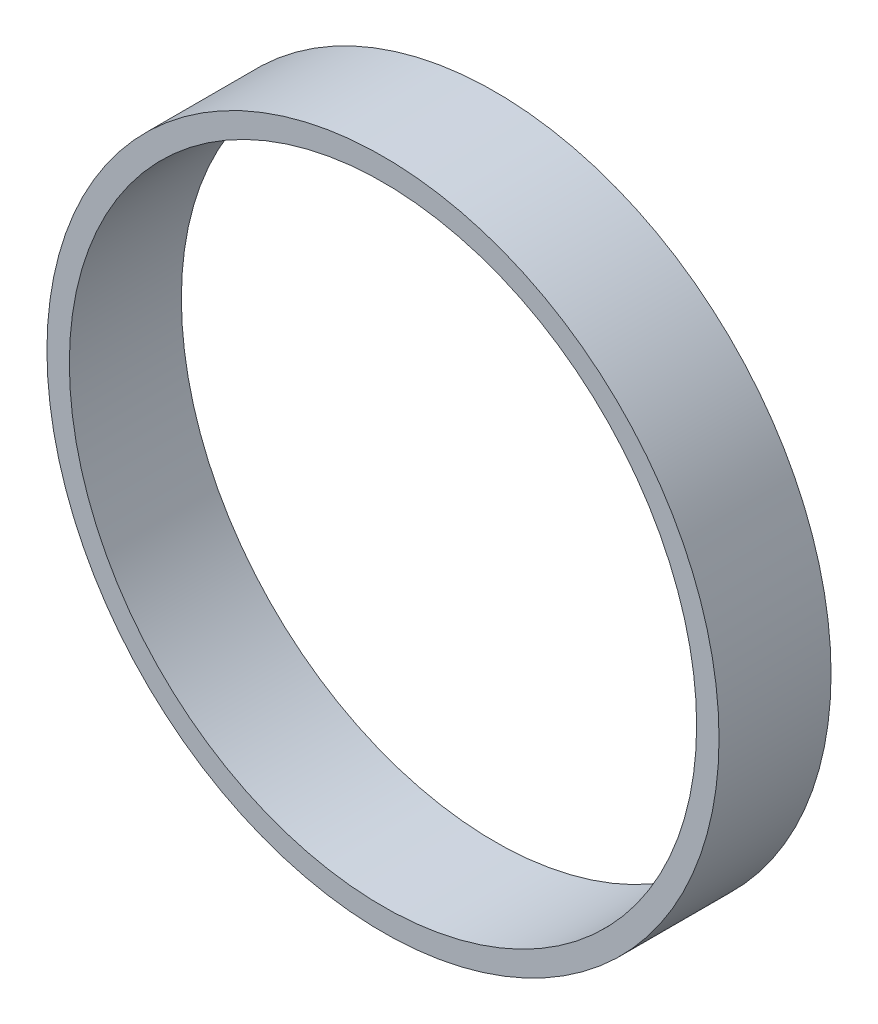
ISO-10303-21;
HEADER;
FILE_DESCRIPTION(('STEP AP214'),'2;1');
FILE_NAME('part.step','',(''),(''),'','','');
FILE_SCHEMA(('AUTOMOTIVE_DESIGN { 1 0 10303 214 1 1 1 1 }'));
ENDSEC;
DATA;
#1=APPLICATION_CONTEXT('core data for automotive mechanical design processes');
#2=APPLICATION_PROTOCOL_DEFINITION('international standard','automotive_design',2000,#1);
#3=PRODUCT_CONTEXT('',#1,'mechanical');
#4=PRODUCT('Part','Part','',(#3));
#5=PRODUCT_RELATED_PRODUCT_CATEGORY('part','',(#4));
#6=PRODUCT_DEFINITION_FORMATION('','',#4);
#7=PRODUCT_DEFINITION_CONTEXT('part definition',#1,'design');
#8=PRODUCT_DEFINITION('design','',#6,#7);
#9=PRODUCT_DEFINITION_SHAPE('','',#8);
#10=(LENGTH_UNIT() NAMED_UNIT(*) SI_UNIT(.MILLI.,.METRE.));
#11=(NAMED_UNIT(*) PLANE_ANGLE_UNIT() SI_UNIT($,.RADIAN.));
#12=(NAMED_UNIT(*) SI_UNIT($,.STERADIAN.) SOLID_ANGLE_UNIT());
#13=UNCERTAINTY_MEASURE_WITH_UNIT(LENGTH_MEASURE(1.E-05),#10,'distance_accuracy_value','');
#14=(GEOMETRIC_REPRESENTATION_CONTEXT(3) GLOBAL_UNCERTAINTY_ASSIGNED_CONTEXT((#13)) GLOBAL_UNIT_ASSIGNED_CONTEXT((#10,
#11,#12)) REPRESENTATION_CONTEXT('',''));
#15=CARTESIAN_POINT('',(0.,0.,0.));
#16=DIRECTION('',(0.,0.,1.));
#17=DIRECTION('',(1.,0.,0.));
#18=AXIS2_PLACEMENT_3D('',#15,#16,#17);
#19=CARTESIAN_POINT('',(0.,0.,20.));
#20=DIRECTION('',(0.,0.,1.));
#21=DIRECTION('',(1.,0.,0.));
#22=AXIS2_PLACEMENT_3D('',#19,#20,#21);
#23=PLANE('',#22);
#24=CARTESIAN_POINT('',(0.,0.,20.));
#25=DIRECTION('',(0.,0.,1.));
#26=DIRECTION('',(1.,0.,0.));
#27=AXIS2_PLACEMENT_3D('',#24,#25,#26);
#28=CIRCLE('',#27,60.);
#29=CARTESIAN_POINT('',(60.,0.,20.));
#30=VERTEX_POINT('',#29);
#31=EDGE_CURVE('E10',#30,#30,#28,.T.);
#32=ORIENTED_EDGE('',*,*,#31,.T.);
#33=EDGE_LOOP('',(#32));
#34=FACE_BOUND('',#33,.T.);
#35=CARTESIAN_POINT('',(0.,0.,20.));
#36=DIRECTION('',(0.,0.,1.));
#37=DIRECTION('',(1.,0.,0.));
#38=AXIS2_PLACEMENT_3D('',#35,#36,#37);
#39=CIRCLE('',#38,56.);
#40=CARTESIAN_POINT('',(56.,0.,20.));
#41=VERTEX_POINT('',#40);
#42=EDGE_CURVE('E43',#41,#41,#39,.T.);
#43=ORIENTED_EDGE('',*,*,#42,.F.);
#44=EDGE_LOOP('',(#43));
#45=FACE_BOUND('',#44,.T.);
#46=ADVANCED_FACE('F32',(#34,#45),#23,.T.);
#47=CARTESIAN_POINT('',(0.,0.,0.));
#48=DIRECTION('',(0.,0.,1.));
#49=DIRECTION('',(1.,0.,0.));
#50=AXIS2_PLACEMENT_3D('',#47,#48,#49);
#51=PLANE('',#50);
#52=CARTESIAN_POINT('',(0.,0.,0.));
#53=DIRECTION('',(0.,0.,1.));
#54=DIRECTION('',(1.,0.,0.));
#55=AXIS2_PLACEMENT_3D('',#52,#53,#54);
#56=CIRCLE('',#55,60.);
#57=CARTESIAN_POINT('',(60.,0.,0.));
#58=VERTEX_POINT('',#57);
#59=EDGE_CURVE('E36',#58,#58,#56,.T.);
#60=ORIENTED_EDGE('',*,*,#59,.F.);
#61=EDGE_LOOP('',(#60));
#62=FACE_BOUND('',#61,.T.);
#63=CARTESIAN_POINT('',(0.,0.,0.));
#64=DIRECTION('',(0.,0.,1.));
#65=DIRECTION('',(1.,0.,0.));
#66=AXIS2_PLACEMENT_3D('',#63,#64,#65);
#67=CIRCLE('',#66,56.);
#68=CARTESIAN_POINT('',(56.,0.,0.));
#69=VERTEX_POINT('',#68);
#70=EDGE_CURVE('E45',#69,#69,#67,.T.);
#71=ORIENTED_EDGE('',*,*,#70,.T.);
#72=EDGE_LOOP('',(#71));
#73=FACE_BOUND('',#72,.T.);
#74=ADVANCED_FACE('F55',(#62,#73),#51,.F.);
#75=CARTESIAN_POINT('',(0.,0.,20.));
#76=DIRECTION('',(0.,0.,-1.));
#77=DIRECTION('',(-1.,0.,0.));
#78=AXIS2_PLACEMENT_3D('',#75,#76,#77);
#79=CYLINDRICAL_SURFACE('',#78,60.);
#80=ORIENTED_EDGE('',*,*,#31,.F.);
#81=EDGE_LOOP('',(#80));
#82=FACE_BOUND('',#81,.T.);
#83=ORIENTED_EDGE('',*,*,#59,.T.);
#84=EDGE_LOOP('',(#83));
#85=FACE_BOUND('',#84,.T.);
#86=ADVANCED_FACE('F34',(#82,#85),#79,.T.);
#87=CARTESIAN_POINT('',(0.,0.,20.));
#88=DIRECTION('',(0.,0.,-1.));
#89=DIRECTION('',(-1.,0.,0.));
#90=AXIS2_PLACEMENT_3D('',#87,#88,#89);
#91=CYLINDRICAL_SURFACE('',#90,56.);
#92=ORIENTED_EDGE('',*,*,#42,.T.);
#93=EDGE_LOOP('',(#92));
#94=FACE_BOUND('',#93,.T.);
#95=ORIENTED_EDGE('',*,*,#70,.F.);
#96=EDGE_LOOP('',(#95));
#97=FACE_BOUND('',#96,.T.);
#98=ADVANCED_FACE('F51',(#94,#97),#91,.F.);
#99=CLOSED_SHELL('',(#46,#74,#86,#98));
#100=MANIFOLD_SOLID_BREP('B2',#99);
#101=ADVANCED_BREP_SHAPE_REPRESENTATION('',(#18,#100),#14);
#102=SHAPE_DEFINITION_REPRESENTATION(#9,#101);
ENDSEC;
END-ISO-10303-21;
